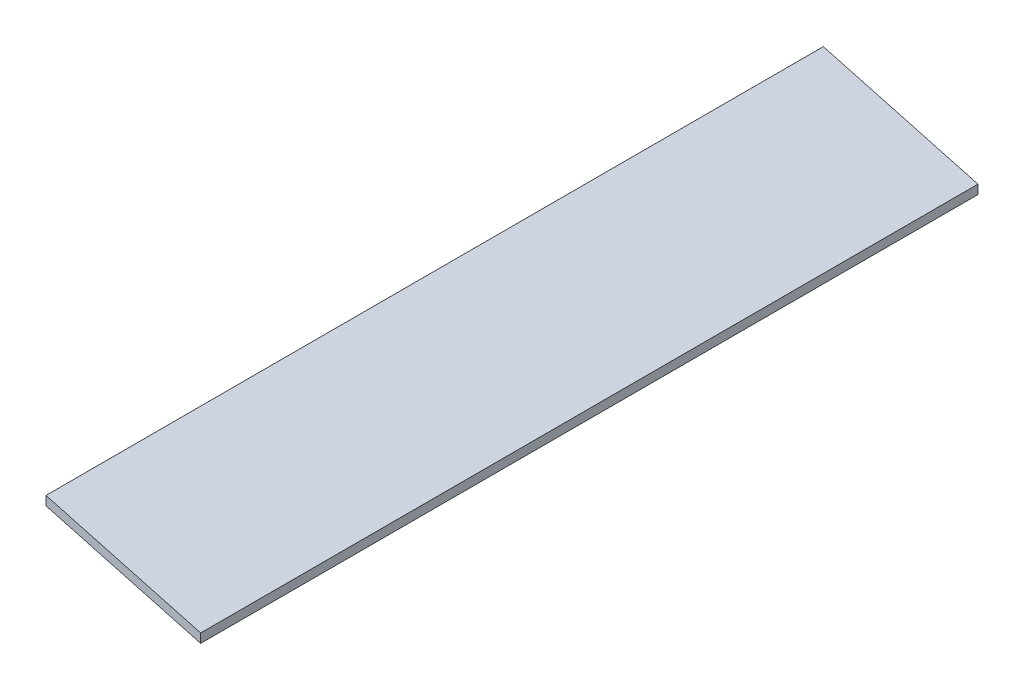
ISO-10303-21;
HEADER;
FILE_DESCRIPTION(('STEP AP214'),'2;1');
FILE_NAME('part.step','',(''),(''),'','','');
FILE_SCHEMA(('AUTOMOTIVE_DESIGN { 1 0 10303 214 1 1 1 1 }'));
ENDSEC;
DATA;
#1=APPLICATION_CONTEXT('core data for automotive mechanical design processes');
#2=APPLICATION_PROTOCOL_DEFINITION('international standard','automotive_design',2000,#1);
#3=PRODUCT_CONTEXT('',#1,'mechanical');
#4=PRODUCT('Part','Part','',(#3));
#5=PRODUCT_RELATED_PRODUCT_CATEGORY('part','',(#4));
#6=PRODUCT_DEFINITION_FORMATION('','',#4);
#7=PRODUCT_DEFINITION_CONTEXT('part definition',#1,'design');
#8=PRODUCT_DEFINITION('design','',#6,#7);
#9=PRODUCT_DEFINITION_SHAPE('','',#8);
#10=(LENGTH_UNIT() NAMED_UNIT(*) SI_UNIT(.MILLI.,.METRE.));
#11=(NAMED_UNIT(*) PLANE_ANGLE_UNIT() SI_UNIT($,.RADIAN.));
#12=(NAMED_UNIT(*) SI_UNIT($,.STERADIAN.) SOLID_ANGLE_UNIT());
#13=UNCERTAINTY_MEASURE_WITH_UNIT(LENGTH_MEASURE(1.E-05),#10,'distance_accuracy_value','');
#14=(GEOMETRIC_REPRESENTATION_CONTEXT(3) GLOBAL_UNCERTAINTY_ASSIGNED_CONTEXT((#13)) GLOBAL_UNIT_ASSIGNED_CONTEXT((#10,
#11,#12)) REPRESENTATION_CONTEXT('',''));
#15=CARTESIAN_POINT('',(0.,0.,0.));
#16=DIRECTION('',(0.,0.,1.));
#17=DIRECTION('',(1.,0.,0.));
#18=AXIS2_PLACEMENT_3D('',#15,#16,#17);
#19=CARTESIAN_POINT('',(-8.631267976045,2.16,0.));
#20=DIRECTION('',(0.,1.,0.));
#21=DIRECTION('',(0.,0.,1.));
#22=AXIS2_PLACEMENT_3D('',#19,#20,#21);
#23=PLANE('',#22);
#24=DIRECTION('',(0.,0.,-1.));
#25=VECTOR('',#24,1.);
#26=CARTESIAN_POINT('',(1.504857505925,2.16,0.));
#27=LINE('',#26,#25);
#28=CARTESIAN_POINT('',(1.50485750592518,2.16,-2.26142333785685));
#29=VERTEX_POINT('',#28);
#30=CARTESIAN_POINT('',(1.50485750592516,2.16,-1.40187144724574));
#31=VERTEX_POINT('',#30);
#32=EDGE_CURVE('E58',#29,#31,#27,.F.);
#33=ORIENTED_EDGE('',*,*,#32,.F.);
#34=DIRECTION('',(-0.978152936258662,0.,-0.207886587562928));
#35=VECTOR('',#34,1.);
#36=CARTESIAN_POINT('',(-7.733367882601,2.16,-4.224820962063));
#37=LINE('',#36,#35);
#38=CARTESIAN_POINT('',(1.28764409228517,2.16,-2.30758764781378));
#39=VERTEX_POINT('',#38);
#40=EDGE_CURVE('E53',#39,#29,#37,.F.);
#41=ORIENTED_EDGE('',*,*,#40,.F.);
#42=DIRECTION('',(0.,0.,1.));
#43=VECTOR('',#42,1.);
#44=CARTESIAN_POINT('',(1.287644092285,2.16,0.));
#45=LINE('',#44,#43);
#46=CARTESIAN_POINT('',(1.28764409228539,2.16,-1.44803575720281));
#47=VERTEX_POINT('',#46);
#48=EDGE_CURVE('E68',#47,#39,#45,.F.);
#49=ORIENTED_EDGE('',*,*,#48,.F.);
#50=DIRECTION('',(0.978152936258662,0.,0.207886587562928));
#51=VECTOR('',#50,1.);
#52=CARTESIAN_POINT('',(-7.908153355242,2.16,-3.402416182211));
#53=LINE('',#52,#51);
#54=EDGE_CURVE('E20',#31,#47,#53,.F.);
#55=ORIENTED_EDGE('',*,*,#54,.F.);
#56=EDGE_LOOP('',(#33,#41,#49,#55));
#57=FACE_BOUND('',#56,.T.);
#58=ADVANCED_FACE('F17',(#57),#23,.T.);
#59=CARTESIAN_POINT('',(-7.908153355242,2.16,-3.402416182211));
#60=DIRECTION('',(-0.207886587562928,0.,0.978152936258662));
#61=DIRECTION('',(0.978152936258662,0.,0.207886587562928));
#62=AXIS2_PLACEMENT_3D('',#59,#60,#61);
#63=PLANE('',#62);
#64=ORIENTED_EDGE('',*,*,#54,.T.);
#65=DIRECTION('',(0.,1.,0.));
#66=VECTOR('',#65,1.);
#67=CARTESIAN_POINT('',(1.287644092285,2.16,-1.448035757201));
#68=LINE('',#67,#66);
#69=CARTESIAN_POINT('',(1.28764409228539,2.15,-1.44803575720281));
#70=VERTEX_POINT('',#69);
#71=EDGE_CURVE('E79',#70,#47,#68,.T.);
#72=ORIENTED_EDGE('',*,*,#71,.F.);
#73=DIRECTION('',(0.978152936259315,0.,0.207886587559854));
#74=VECTOR('',#73,1.);
#75=CARTESIAN_POINT('',(1.287644092285,2.15,-1.448035757201));
#76=LINE('',#75,#74);
#77=CARTESIAN_POINT('',(1.50485750592531,2.15,-1.40187144724647));
#78=VERTEX_POINT('',#77);
#79=EDGE_CURVE('E74',#70,#78,#76,.T.);
#80=ORIENTED_EDGE('',*,*,#79,.T.);
#81=DIRECTION('',(0.,1.,0.));
#82=VECTOR('',#81,1.);
#83=CARTESIAN_POINT('',(1.504857505925,2.16,-1.401871447245));
#84=LINE('',#83,#82);
#85=EDGE_CURVE('E63',#31,#78,#84,.F.);
#86=ORIENTED_EDGE('',*,*,#85,.F.);
#87=EDGE_LOOP('',(#64,#72,#80,#86));
#88=FACE_BOUND('',#87,.T.);
#89=ADVANCED_FACE('F73',(#88),#63,.T.);
#90=CARTESIAN_POINT('',(1.504857505925,2.16,0.));
#91=DIRECTION('',(1.,0.,0.));
#92=DIRECTION('',(0.,0.,-1.));
#93=AXIS2_PLACEMENT_3D('',#90,#91,#92);
#94=PLANE('',#93);
#95=ORIENTED_EDGE('',*,*,#32,.T.);
#96=ORIENTED_EDGE('',*,*,#85,.T.);
#97=DIRECTION('',(0.,0.,1.));
#98=VECTOR('',#97,1.);
#99=CARTESIAN_POINT('',(1.504857505925,2.15,0.));
#100=LINE('',#99,#98);
#101=CARTESIAN_POINT('',(1.50485750592518,2.15,-2.26142333785685));
#102=VERTEX_POINT('',#101);
#103=EDGE_CURVE('E84',#78,#102,#100,.F.);
#104=ORIENTED_EDGE('',*,*,#103,.T.);
#105=DIRECTION('',(0.,1.,0.));
#106=VECTOR('',#105,1.);
#107=CARTESIAN_POINT('',(1.50485750592572,2.16,-2.26142333785941));
#108=LINE('',#107,#106);
#109=EDGE_CURVE('E65',#29,#102,#108,.F.);
#110=ORIENTED_EDGE('',*,*,#109,.F.);
#111=EDGE_LOOP('',(#95,#96,#104,#110));
#112=FACE_BOUND('',#111,.T.);
#113=ADVANCED_FACE('F60',(#112),#94,.T.);
#114=CARTESIAN_POINT('',(-7.733367882601,2.16,-4.224820962063));
#115=DIRECTION('',(0.207886587562928,0.,-0.978152936258662));
#116=DIRECTION('',(-0.978152936258662,0.,-0.207886587562928));
#117=AXIS2_PLACEMENT_3D('',#114,#115,#116);
#118=PLANE('',#117);
#119=ORIENTED_EDGE('',*,*,#40,.T.);
#120=ORIENTED_EDGE('',*,*,#109,.T.);
#121=DIRECTION('',(-0.978152936258399,0.,-0.207886587564163));
#122=VECTOR('',#121,1.);
#123=CARTESIAN_POINT('',(1.504857505925,2.15,-2.261423337856));
#124=LINE('',#123,#122);
#125=CARTESIAN_POINT('',(1.28764409228533,2.15,-2.30758764781457));
#126=VERTEX_POINT('',#125);
#127=EDGE_CURVE('E26',#102,#126,#124,.T.);
#128=ORIENTED_EDGE('',*,*,#127,.T.);
#129=DIRECTION('',(0.,1.,0.));
#130=VECTOR('',#129,1.);
#131=CARTESIAN_POINT('',(1.287644092285,2.16,-2.307587647813));
#132=LINE('',#131,#130);
#133=EDGE_CURVE('E34',#39,#126,#132,.F.);
#134=ORIENTED_EDGE('',*,*,#133,.F.);
#135=EDGE_LOOP('',(#119,#120,#128,#134));
#136=FACE_BOUND('',#135,.T.);
#137=ADVANCED_FACE('F88',(#136),#118,.T.);
#138=CARTESIAN_POINT('',(1.287644092285,2.16,0.));
#139=DIRECTION('',(-1.,0.,0.));
#140=DIRECTION('',(0.,0.,1.));
#141=AXIS2_PLACEMENT_3D('',#138,#139,#140);
#142=PLANE('',#141);
#143=ORIENTED_EDGE('',*,*,#48,.T.);
#144=ORIENTED_EDGE('',*,*,#133,.T.);
#145=DIRECTION('',(0.,0.,1.));
#146=VECTOR('',#145,1.);
#147=CARTESIAN_POINT('',(1.287644092285,2.15,0.));
#148=LINE('',#147,#146);
#149=EDGE_CURVE('E11',#126,#70,#148,.T.);
#150=ORIENTED_EDGE('',*,*,#149,.T.);
#151=ORIENTED_EDGE('',*,*,#71,.T.);
#152=EDGE_LOOP('',(#143,#144,#150,#151));
#153=FACE_BOUND('',#152,.T.);
#154=ADVANCED_FACE('F91',(#153),#142,.T.);
#155=CARTESIAN_POINT('',(-8.631267976045,2.15,0.));
#156=DIRECTION('',(0.,1.,0.));
#157=DIRECTION('',(0.,0.,1.));
#158=AXIS2_PLACEMENT_3D('',#155,#156,#157);
#159=PLANE('',#158);
#160=ORIENTED_EDGE('',*,*,#127,.F.);
#161=ORIENTED_EDGE('',*,*,#103,.F.);
#162=ORIENTED_EDGE('',*,*,#79,.F.);
#163=ORIENTED_EDGE('',*,*,#149,.F.);
#164=EDGE_LOOP('',(#160,#161,#162,#163));
#165=FACE_BOUND('',#164,.T.);
#166=ADVANCED_FACE('F90',(#165),#159,.F.);
#167=CLOSED_SHELL('',(#58,#89,#113,#137,#154,#166));
#168=MANIFOLD_SOLID_BREP('B1',#167);
#169=ADVANCED_BREP_SHAPE_REPRESENTATION('',(#18,#168),#14);
#170=SHAPE_DEFINITION_REPRESENTATION(#9,#169);
ENDSEC;
END-ISO-10303-21;
